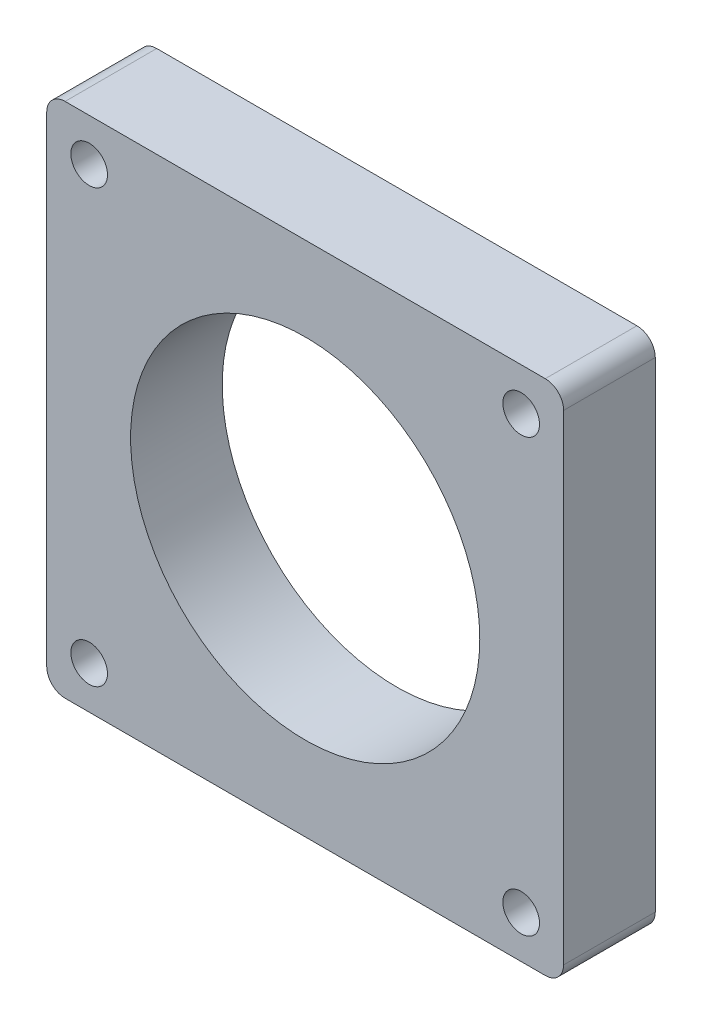
ISO-10303-21;
HEADER;
FILE_DESCRIPTION(('STEP AP214'),'2;1');
FILE_NAME('part.step','',(''),(''),'','','');
FILE_SCHEMA(('AUTOMOTIVE_DESIGN { 1 0 10303 214 1 1 1 1 }'));
ENDSEC;
DATA;
#1=APPLICATION_CONTEXT('core data for automotive mechanical design processes');
#2=APPLICATION_PROTOCOL_DEFINITION('international standard','automotive_design',2000,#1);
#3=PRODUCT_CONTEXT('',#1,'mechanical');
#4=PRODUCT('Part','Part','',(#3));
#5=PRODUCT_RELATED_PRODUCT_CATEGORY('part','',(#4));
#6=PRODUCT_DEFINITION_FORMATION('','',#4);
#7=PRODUCT_DEFINITION_CONTEXT('part definition',#1,'design');
#8=PRODUCT_DEFINITION('design','',#6,#7);
#9=PRODUCT_DEFINITION_SHAPE('','',#8);
#10=(LENGTH_UNIT() NAMED_UNIT(*) SI_UNIT(.MILLI.,.METRE.));
#11=(NAMED_UNIT(*) PLANE_ANGLE_UNIT() SI_UNIT($,.RADIAN.));
#12=(NAMED_UNIT(*) SI_UNIT($,.STERADIAN.) SOLID_ANGLE_UNIT());
#13=UNCERTAINTY_MEASURE_WITH_UNIT(LENGTH_MEASURE(1.E-05),#10,'distance_accuracy_value','');
#14=(GEOMETRIC_REPRESENTATION_CONTEXT(3) GLOBAL_UNCERTAINTY_ASSIGNED_CONTEXT((#13)) GLOBAL_UNIT_ASSIGNED_CONTEXT((#10,
#11,#12)) REPRESENTATION_CONTEXT('',''));
#15=CARTESIAN_POINT('',(0.,0.,0.));
#16=DIRECTION('',(0.,0.,1.));
#17=DIRECTION('',(1.,0.,0.));
#18=AXIS2_PLACEMENT_3D('',#15,#16,#17);
#19=CARTESIAN_POINT('',(0.,0.,10.));
#20=DIRECTION('',(0.,0.,-1.));
#21=DIRECTION('',(-1.,0.,0.));
#22=AXIS2_PLACEMENT_3D('',#19,#20,#21);
#23=PLANE('',#22);
#24=CARTESIAN_POINT('',(0.,0.,10.));
#25=DIRECTION('',(0.,0.,1.));
#26=DIRECTION('',(1.,0.,0.));
#27=AXIS2_PLACEMENT_3D('',#24,#25,#26);
#28=CIRCLE('',#27,19.05);
#29=CARTESIAN_POINT('',(19.05,0.,10.));
#30=VERTEX_POINT('',#29);
#31=EDGE_CURVE('E237',#30,#30,#28,.T.);
#32=ORIENTED_EDGE('',*,*,#31,.F.);
#33=EDGE_LOOP('',(#32));
#34=FACE_BOUND('',#33,.T.);
#35=DIRECTION('',(0.,-1.,0.));
#36=VECTOR('',#35,1.);
#37=CARTESIAN_POINT('',(-28.2,-28.2,10.));
#38=LINE('',#37,#36);
#39=CARTESIAN_POINT('',(-28.2,26.2,10.));
#40=VERTEX_POINT('',#39);
#41=CARTESIAN_POINT('',(-28.2,-26.2,10.));
#42=VERTEX_POINT('',#41);
#43=EDGE_CURVE('E196',#40,#42,#38,.T.);
#44=ORIENTED_EDGE('',*,*,#43,.T.);
#45=CARTESIAN_POINT('',(-26.2,-26.2,10.));
#46=DIRECTION('',(0.,0.,-1.));
#47=DIRECTION('',(-1.,0.,0.));
#48=AXIS2_PLACEMENT_3D('',#45,#46,#47);
#49=CIRCLE('',#48,2.);
#50=CARTESIAN_POINT('',(-26.2,-28.2,10.));
#51=VERTEX_POINT('',#50);
#52=EDGE_CURVE('E173',#42,#51,#49,.F.);
#53=ORIENTED_EDGE('',*,*,#52,.T.);
#54=DIRECTION('',(1.,0.,0.));
#55=VECTOR('',#54,1.);
#56=CARTESIAN_POINT('',(-28.2,-28.2,10.));
#57=LINE('',#56,#55);
#58=CARTESIAN_POINT('',(26.2,-28.2,10.));
#59=VERTEX_POINT('',#58);
#60=EDGE_CURVE('E132',#51,#59,#57,.T.);
#61=ORIENTED_EDGE('',*,*,#60,.T.);
#62=CARTESIAN_POINT('',(26.2,-26.2,10.));
#63=DIRECTION('',(0.,0.,-1.));
#64=DIRECTION('',(-1.,0.,0.));
#65=AXIS2_PLACEMENT_3D('',#62,#63,#64);
#66=CIRCLE('',#65,2.);
#67=CARTESIAN_POINT('',(28.2,-26.2,10.));
#68=VERTEX_POINT('',#67);
#69=EDGE_CURVE('E171',#59,#68,#66,.F.);
#70=ORIENTED_EDGE('',*,*,#69,.T.);
#71=DIRECTION('',(0.,1.,0.));
#72=VECTOR('',#71,1.);
#73=CARTESIAN_POINT('',(28.2,-28.2,10.));
#74=LINE('',#73,#72);
#75=CARTESIAN_POINT('',(28.2,26.2,10.));
#76=VERTEX_POINT('',#75);
#77=EDGE_CURVE('E143',#68,#76,#74,.T.);
#78=ORIENTED_EDGE('',*,*,#77,.T.);
#79=CARTESIAN_POINT('',(26.2,26.2,10.));
#80=DIRECTION('',(0.,0.,-1.));
#81=DIRECTION('',(-1.,0.,0.));
#82=AXIS2_PLACEMENT_3D('',#79,#80,#81);
#83=CIRCLE('',#82,2.);
#84=CARTESIAN_POINT('',(26.2,28.2,10.));
#85=VERTEX_POINT('',#84);
#86=EDGE_CURVE('E69',#76,#85,#83,.F.);
#87=ORIENTED_EDGE('',*,*,#86,.T.);
#88=DIRECTION('',(-1.,0.,0.));
#89=VECTOR('',#88,1.);
#90=CARTESIAN_POINT('',(-28.2,28.2,10.));
#91=LINE('',#90,#89);
#92=CARTESIAN_POINT('',(-26.2,28.2,10.));
#93=VERTEX_POINT('',#92);
#94=EDGE_CURVE('E148',#85,#93,#91,.T.);
#95=ORIENTED_EDGE('',*,*,#94,.T.);
#96=CARTESIAN_POINT('',(-26.2,26.2,10.));
#97=DIRECTION('',(0.,0.,-1.));
#98=DIRECTION('',(-1.,0.,0.));
#99=AXIS2_PLACEMENT_3D('',#96,#97,#98);
#100=CIRCLE('',#99,2.);
#101=EDGE_CURVE('E169',#93,#40,#100,.F.);
#102=ORIENTED_EDGE('',*,*,#101,.T.);
#103=EDGE_LOOP('',(#44,#53,#61,#70,#78,#87,#95,#102));
#104=FACE_BOUND('',#103,.T.);
#105=CARTESIAN_POINT('',(23.57,23.57,10.));
#106=DIRECTION('',(0.,0.,1.));
#107=DIRECTION('',(1.,0.,0.));
#108=AXIS2_PLACEMENT_3D('',#105,#106,#107);
#109=CIRCLE('',#108,2.00000000000001);
#110=CARTESIAN_POINT('',(25.57,23.57,10.));
#111=VERTEX_POINT('',#110);
#112=EDGE_CURVE('E195',#111,#111,#109,.T.);
#113=ORIENTED_EDGE('',*,*,#112,.F.);
#114=EDGE_LOOP('',(#113));
#115=FACE_BOUND('',#114,.T.);
#116=CARTESIAN_POINT('',(-23.57,23.57,10.));
#117=DIRECTION('',(0.,0.,1.));
#118=DIRECTION('',(-1.,0.,0.));
#119=AXIS2_PLACEMENT_3D('',#116,#117,#118);
#120=CIRCLE('',#119,2.);
#121=CARTESIAN_POINT('',(-25.57,23.57,10.));
#122=VERTEX_POINT('',#121);
#123=EDGE_CURVE('E208',#122,#122,#120,.T.);
#124=ORIENTED_EDGE('',*,*,#123,.F.);
#125=EDGE_LOOP('',(#124));
#126=FACE_BOUND('',#125,.T.);
#127=CARTESIAN_POINT('',(23.57,-23.57,10.));
#128=DIRECTION('',(0.,0.,1.));
#129=DIRECTION('',(-1.,0.,0.));
#130=AXIS2_PLACEMENT_3D('',#127,#128,#129);
#131=CIRCLE('',#130,2.00000000000001);
#132=CARTESIAN_POINT('',(21.57,-23.57,10.));
#133=VERTEX_POINT('',#132);
#134=EDGE_CURVE('E216',#133,#133,#131,.T.);
#135=ORIENTED_EDGE('',*,*,#134,.F.);
#136=EDGE_LOOP('',(#135));
#137=FACE_BOUND('',#136,.T.);
#138=CARTESIAN_POINT('',(-23.57,-23.57,10.));
#139=DIRECTION('',(0.,0.,1.));
#140=DIRECTION('',(1.,0.,0.));
#141=AXIS2_PLACEMENT_3D('',#138,#139,#140);
#142=CIRCLE('',#141,2.);
#143=CARTESIAN_POINT('',(-21.57,-23.57,10.));
#144=VERTEX_POINT('',#143);
#145=EDGE_CURVE('E221',#144,#144,#142,.T.);
#146=ORIENTED_EDGE('',*,*,#145,.F.);
#147=EDGE_LOOP('',(#146));
#148=FACE_BOUND('',#147,.T.);
#149=ADVANCED_FACE('F44',(#34,#104,#115,#126,#137,#148),#23,.F.);
#150=CARTESIAN_POINT('',(0.,0.,0.));
#151=DIRECTION('',(0.,0.,-1.));
#152=DIRECTION('',(-1.,0.,0.));
#153=AXIS2_PLACEMENT_3D('',#150,#151,#152);
#154=PLANE('',#153);
#155=CARTESIAN_POINT('',(0.,0.,0.));
#156=DIRECTION('',(0.,0.,1.));
#157=DIRECTION('',(1.,0.,0.));
#158=AXIS2_PLACEMENT_3D('',#155,#156,#157);
#159=CIRCLE('',#158,19.05);
#160=CARTESIAN_POINT('',(19.05,0.,0.));
#161=VERTEX_POINT('',#160);
#162=EDGE_CURVE('E231',#161,#161,#159,.T.);
#163=ORIENTED_EDGE('',*,*,#162,.T.);
#164=EDGE_LOOP('',(#163));
#165=FACE_BOUND('',#164,.T.);
#166=CARTESIAN_POINT('',(23.57,-23.57,0.));
#167=DIRECTION('',(0.,0.,1.));
#168=DIRECTION('',(-1.,0.,0.));
#169=AXIS2_PLACEMENT_3D('',#166,#167,#168);
#170=CIRCLE('',#169,2.00000000000001);
#171=CARTESIAN_POINT('',(21.57,-23.57,0.));
#172=VERTEX_POINT('',#171);
#173=EDGE_CURVE('E219',#172,#172,#170,.T.);
#174=ORIENTED_EDGE('',*,*,#173,.T.);
#175=EDGE_LOOP('',(#174));
#176=FACE_BOUND('',#175,.T.);
#177=CARTESIAN_POINT('',(23.57,23.57,0.));
#178=DIRECTION('',(0.,0.,1.));
#179=DIRECTION('',(1.,0.,0.));
#180=AXIS2_PLACEMENT_3D('',#177,#178,#179);
#181=CIRCLE('',#180,2.00000000000001);
#182=CARTESIAN_POINT('',(25.57,23.57,0.));
#183=VERTEX_POINT('',#182);
#184=EDGE_CURVE('E204',#183,#183,#181,.T.);
#185=ORIENTED_EDGE('',*,*,#184,.T.);
#186=EDGE_LOOP('',(#185));
#187=FACE_BOUND('',#186,.T.);
#188=DIRECTION('',(1.,0.,0.));
#189=VECTOR('',#188,1.);
#190=CARTESIAN_POINT('',(-28.2,-28.2,0.));
#191=LINE('',#190,#189);
#192=CARTESIAN_POINT('',(-26.2,-28.2,0.));
#193=VERTEX_POINT('',#192);
#194=CARTESIAN_POINT('',(26.2,-28.2,0.));
#195=VERTEX_POINT('',#194);
#196=EDGE_CURVE('E129',#193,#195,#191,.T.);
#197=ORIENTED_EDGE('',*,*,#196,.F.);
#198=CARTESIAN_POINT('',(-26.2,-26.2,0.));
#199=DIRECTION('',(0.,0.,-1.));
#200=DIRECTION('',(-1.,0.,0.));
#201=AXIS2_PLACEMENT_3D('',#198,#199,#200);
#202=CIRCLE('',#201,2.);
#203=CARTESIAN_POINT('',(-28.2,-26.2,0.));
#204=VERTEX_POINT('',#203);
#205=EDGE_CURVE('E112',#193,#204,#202,.T.);
#206=ORIENTED_EDGE('',*,*,#205,.T.);
#207=DIRECTION('',(0.,-1.,0.));
#208=VECTOR('',#207,1.);
#209=CARTESIAN_POINT('',(-28.2,-28.2,0.));
#210=LINE('',#209,#208);
#211=CARTESIAN_POINT('',(-28.2,26.2,0.));
#212=VERTEX_POINT('',#211);
#213=EDGE_CURVE('E142',#212,#204,#210,.T.);
#214=ORIENTED_EDGE('',*,*,#213,.F.);
#215=CARTESIAN_POINT('',(-26.2,26.2,0.));
#216=DIRECTION('',(0.,0.,-1.));
#217=DIRECTION('',(-1.,0.,0.));
#218=AXIS2_PLACEMENT_3D('',#215,#216,#217);
#219=CIRCLE('',#218,2.);
#220=CARTESIAN_POINT('',(-26.2,28.2,0.));
#221=VERTEX_POINT('',#220);
#222=EDGE_CURVE('E156',#212,#221,#219,.T.);
#223=ORIENTED_EDGE('',*,*,#222,.T.);
#224=DIRECTION('',(-1.,0.,0.));
#225=VECTOR('',#224,1.);
#226=CARTESIAN_POINT('',(-28.2,28.2,0.));
#227=LINE('',#226,#225);
#228=CARTESIAN_POINT('',(26.2,28.2,0.));
#229=VERTEX_POINT('',#228);
#230=EDGE_CURVE('E146',#229,#221,#227,.T.);
#231=ORIENTED_EDGE('',*,*,#230,.F.);
#232=CARTESIAN_POINT('',(26.2,26.2,0.));
#233=DIRECTION('',(0.,0.,-1.));
#234=DIRECTION('',(-1.,0.,0.));
#235=AXIS2_PLACEMENT_3D('',#232,#233,#234);
#236=CIRCLE('',#235,2.);
#237=CARTESIAN_POINT('',(28.2,26.2,0.));
#238=VERTEX_POINT('',#237);
#239=EDGE_CURVE('E133',#229,#238,#236,.T.);
#240=ORIENTED_EDGE('',*,*,#239,.T.);
#241=DIRECTION('',(0.,1.,0.));
#242=VECTOR('',#241,1.);
#243=CARTESIAN_POINT('',(28.2,-28.2,0.));
#244=LINE('',#243,#242);
#245=CARTESIAN_POINT('',(28.2,-26.2,0.));
#246=VERTEX_POINT('',#245);
#247=EDGE_CURVE('E194',#246,#238,#244,.T.);
#248=ORIENTED_EDGE('',*,*,#247,.F.);
#249=CARTESIAN_POINT('',(26.2,-26.2,0.));
#250=DIRECTION('',(0.,0.,-1.));
#251=DIRECTION('',(-1.,0.,0.));
#252=AXIS2_PLACEMENT_3D('',#249,#250,#251);
#253=CIRCLE('',#252,2.);
#254=EDGE_CURVE('E125',#246,#195,#253,.T.);
#255=ORIENTED_EDGE('',*,*,#254,.T.);
#256=EDGE_LOOP('',(#197,#206,#214,#223,#231,#240,#248,#255));
#257=FACE_BOUND('',#256,.T.);
#258=CARTESIAN_POINT('',(-23.57,23.57,0.));
#259=DIRECTION('',(0.,0.,1.));
#260=DIRECTION('',(-1.,0.,0.));
#261=AXIS2_PLACEMENT_3D('',#258,#259,#260);
#262=CIRCLE('',#261,2.);
#263=CARTESIAN_POINT('',(-25.57,23.57,0.));
#264=VERTEX_POINT('',#263);
#265=EDGE_CURVE('E215',#264,#264,#262,.T.);
#266=ORIENTED_EDGE('',*,*,#265,.T.);
#267=EDGE_LOOP('',(#266));
#268=FACE_BOUND('',#267,.T.);
#269=CARTESIAN_POINT('',(-23.57,-23.57,0.));
#270=DIRECTION('',(0.,0.,1.));
#271=DIRECTION('',(1.,0.,0.));
#272=AXIS2_PLACEMENT_3D('',#269,#270,#271);
#273=CIRCLE('',#272,2.);
#274=CARTESIAN_POINT('',(-21.57,-23.57,0.));
#275=VERTEX_POINT('',#274);
#276=EDGE_CURVE('E229',#275,#275,#273,.T.);
#277=ORIENTED_EDGE('',*,*,#276,.T.);
#278=EDGE_LOOP('',(#277));
#279=FACE_BOUND('',#278,.T.);
#280=ADVANCED_FACE('F136',(#165,#176,#187,#257,#268,#279),#154,.T.);
#281=CARTESIAN_POINT('',(28.2,-28.2,10.));
#282=DIRECTION('',(-1.,0.,0.));
#283=DIRECTION('',(0.,0.,1.));
#284=AXIS2_PLACEMENT_3D('',#281,#282,#283);
#285=PLANE('',#284);
#286=ORIENTED_EDGE('',*,*,#77,.F.);
#287=DIRECTION('',(0.,0.,-1.));
#288=VECTOR('',#287,1.);
#289=CARTESIAN_POINT('',(28.2,-26.2,10.));
#290=LINE('',#289,#288);
#291=EDGE_CURVE('E177',#68,#246,#290,.T.);
#292=ORIENTED_EDGE('',*,*,#291,.T.);
#293=ORIENTED_EDGE('',*,*,#247,.T.);
#294=DIRECTION('',(0.,0.,-1.));
#295=VECTOR('',#294,1.);
#296=CARTESIAN_POINT('',(28.2,26.2,10.));
#297=LINE('',#296,#295);
#298=EDGE_CURVE('E176',#238,#76,#297,.F.);
#299=ORIENTED_EDGE('',*,*,#298,.T.);
#300=EDGE_LOOP('',(#286,#292,#293,#299));
#301=FACE_BOUND('',#300,.T.);
#302=ADVANCED_FACE('F275',(#301),#285,.F.);
#303=CARTESIAN_POINT('',(-28.2,28.2,10.));
#304=DIRECTION('',(0.,-1.,0.));
#305=DIRECTION('',(1.,0.,0.));
#306=AXIS2_PLACEMENT_3D('',#303,#304,#305);
#307=PLANE('',#306);
#308=ORIENTED_EDGE('',*,*,#230,.T.);
#309=DIRECTION('',(0.,0.,-1.));
#310=VECTOR('',#309,1.);
#311=CARTESIAN_POINT('',(-26.2,28.2,10.));
#312=LINE('',#311,#310);
#313=EDGE_CURVE('E11',#221,#93,#312,.F.);
#314=ORIENTED_EDGE('',*,*,#313,.T.);
#315=ORIENTED_EDGE('',*,*,#94,.F.);
#316=DIRECTION('',(0.,0.,-1.));
#317=VECTOR('',#316,1.);
#318=CARTESIAN_POINT('',(26.2,28.2,10.));
#319=LINE('',#318,#317);
#320=EDGE_CURVE('E53',#85,#229,#319,.T.);
#321=ORIENTED_EDGE('',*,*,#320,.T.);
#322=EDGE_LOOP('',(#308,#314,#315,#321));
#323=FACE_BOUND('',#322,.T.);
#324=ADVANCED_FACE('F187',(#323),#307,.F.);
#325=CARTESIAN_POINT('',(-28.2,-28.2,10.));
#326=DIRECTION('',(1.,0.,0.));
#327=DIRECTION('',(0.,1.,0.));
#328=AXIS2_PLACEMENT_3D('',#325,#326,#327);
#329=PLANE('',#328);
#330=ORIENTED_EDGE('',*,*,#213,.T.);
#331=DIRECTION('',(0.,0.,-1.));
#332=VECTOR('',#331,1.);
#333=CARTESIAN_POINT('',(-28.2,-26.2,10.));
#334=LINE('',#333,#332);
#335=EDGE_CURVE('E116',#204,#42,#334,.F.);
#336=ORIENTED_EDGE('',*,*,#335,.T.);
#337=ORIENTED_EDGE('',*,*,#43,.F.);
#338=DIRECTION('',(0.,0.,-1.));
#339=VECTOR('',#338,1.);
#340=CARTESIAN_POINT('',(-28.2,26.2,10.));
#341=LINE('',#340,#339);
#342=EDGE_CURVE('E121',#40,#212,#341,.T.);
#343=ORIENTED_EDGE('',*,*,#342,.T.);
#344=EDGE_LOOP('',(#330,#336,#337,#343));
#345=FACE_BOUND('',#344,.T.);
#346=ADVANCED_FACE('F283',(#345),#329,.F.);
#347=CARTESIAN_POINT('',(-28.2,-28.2,10.));
#348=DIRECTION('',(0.,1.,0.));
#349=DIRECTION('',(0.,0.,1.));
#350=AXIS2_PLACEMENT_3D('',#347,#348,#349);
#351=PLANE('',#350);
#352=ORIENTED_EDGE('',*,*,#60,.F.);
#353=DIRECTION('',(0.,0.,-1.));
#354=VECTOR('',#353,1.);
#355=CARTESIAN_POINT('',(-26.2,-28.2,10.));
#356=LINE('',#355,#354);
#357=EDGE_CURVE('E113',#51,#193,#356,.T.);
#358=ORIENTED_EDGE('',*,*,#357,.T.);
#359=ORIENTED_EDGE('',*,*,#196,.T.);
#360=DIRECTION('',(0.,0.,-1.));
#361=VECTOR('',#360,1.);
#362=CARTESIAN_POINT('',(26.2,-28.2,10.));
#363=LINE('',#362,#361);
#364=EDGE_CURVE('E135',#195,#59,#363,.F.);
#365=ORIENTED_EDGE('',*,*,#364,.T.);
#366=EDGE_LOOP('',(#352,#358,#359,#365));
#367=FACE_BOUND('',#366,.T.);
#368=ADVANCED_FACE('F126',(#367),#351,.F.);
#369=CARTESIAN_POINT('',(23.57,23.57,10.));
#370=DIRECTION('',(0.,0.,-1.));
#371=DIRECTION('',(-1.,0.,0.));
#372=AXIS2_PLACEMENT_3D('',#369,#370,#371);
#373=CYLINDRICAL_SURFACE('',#372,2.00000000000001);
#374=ORIENTED_EDGE('',*,*,#112,.T.);
#375=EDGE_LOOP('',(#374));
#376=FACE_BOUND('',#375,.T.);
#377=ORIENTED_EDGE('',*,*,#184,.F.);
#378=EDGE_LOOP('',(#377));
#379=FACE_BOUND('',#378,.T.);
#380=ADVANCED_FACE('F284',(#376,#379),#373,.F.);
#381=CARTESIAN_POINT('',(-23.57,23.57,10.));
#382=DIRECTION('',(0.,0.,-1.));
#383=DIRECTION('',(-1.,0.,0.));
#384=AXIS2_PLACEMENT_3D('',#381,#382,#383);
#385=CYLINDRICAL_SURFACE('',#384,2.);
#386=ORIENTED_EDGE('',*,*,#123,.T.);
#387=EDGE_LOOP('',(#386));
#388=FACE_BOUND('',#387,.T.);
#389=ORIENTED_EDGE('',*,*,#265,.F.);
#390=EDGE_LOOP('',(#389));
#391=FACE_BOUND('',#390,.T.);
#392=ADVANCED_FACE('F350',(#388,#391),#385,.F.);
#393=CARTESIAN_POINT('',(23.57,-23.57,10.));
#394=DIRECTION('',(0.,0.,-1.));
#395=DIRECTION('',(-1.,0.,0.));
#396=AXIS2_PLACEMENT_3D('',#393,#394,#395);
#397=CYLINDRICAL_SURFACE('',#396,2.00000000000001);
#398=ORIENTED_EDGE('',*,*,#134,.T.);
#399=EDGE_LOOP('',(#398));
#400=FACE_BOUND('',#399,.T.);
#401=ORIENTED_EDGE('',*,*,#173,.F.);
#402=EDGE_LOOP('',(#401));
#403=FACE_BOUND('',#402,.T.);
#404=ADVANCED_FACE('F270',(#400,#403),#397,.F.);
#405=CARTESIAN_POINT('',(-23.57,-23.57,10.));
#406=DIRECTION('',(0.,0.,-1.));
#407=DIRECTION('',(-1.,0.,0.));
#408=AXIS2_PLACEMENT_3D('',#405,#406,#407);
#409=CYLINDRICAL_SURFACE('',#408,2.);
#410=ORIENTED_EDGE('',*,*,#145,.T.);
#411=EDGE_LOOP('',(#410));
#412=FACE_BOUND('',#411,.T.);
#413=ORIENTED_EDGE('',*,*,#276,.F.);
#414=EDGE_LOOP('',(#413));
#415=FACE_BOUND('',#414,.T.);
#416=ADVANCED_FACE('F248',(#412,#415),#409,.F.);
#417=CARTESIAN_POINT('',(0.,0.,0.));
#418=DIRECTION('',(0.,0.,1.));
#419=DIRECTION('',(1.,0.,0.));
#420=AXIS2_PLACEMENT_3D('',#417,#418,#419);
#421=CYLINDRICAL_SURFACE('',#420,19.05);
#422=ORIENTED_EDGE('',*,*,#162,.F.);
#423=EDGE_LOOP('',(#422));
#424=FACE_BOUND('',#423,.T.);
#425=ORIENTED_EDGE('',*,*,#31,.T.);
#426=EDGE_LOOP('',(#425));
#427=FACE_BOUND('',#426,.T.);
#428=ADVANCED_FACE('F249',(#424,#427),#421,.F.);
#429=CARTESIAN_POINT('',(-26.2,-26.2,10.));
#430=DIRECTION('',(0.,0.,-1.));
#431=DIRECTION('',(-1.,0.,0.));
#432=AXIS2_PLACEMENT_3D('',#429,#430,#431);
#433=CYLINDRICAL_SURFACE('',#432,2.);
#434=ORIENTED_EDGE('',*,*,#52,.F.);
#435=ORIENTED_EDGE('',*,*,#335,.F.);
#436=ORIENTED_EDGE('',*,*,#205,.F.);
#437=ORIENTED_EDGE('',*,*,#357,.F.);
#438=EDGE_LOOP('',(#434,#435,#436,#437));
#439=FACE_BOUND('',#438,.T.);
#440=ADVANCED_FACE('F111',(#439),#433,.T.);
#441=CARTESIAN_POINT('',(26.2,-26.2,10.));
#442=DIRECTION('',(0.,0.,-1.));
#443=DIRECTION('',(-1.,0.,0.));
#444=AXIS2_PLACEMENT_3D('',#441,#442,#443);
#445=CYLINDRICAL_SURFACE('',#444,2.);
#446=ORIENTED_EDGE('',*,*,#69,.F.);
#447=ORIENTED_EDGE('',*,*,#364,.F.);
#448=ORIENTED_EDGE('',*,*,#254,.F.);
#449=ORIENTED_EDGE('',*,*,#291,.F.);
#450=EDGE_LOOP('',(#446,#447,#448,#449));
#451=FACE_BOUND('',#450,.T.);
#452=ADVANCED_FACE('F295',(#451),#445,.T.);
#453=CARTESIAN_POINT('',(-26.2,26.2,10.));
#454=DIRECTION('',(0.,0.,-1.));
#455=DIRECTION('',(-1.,0.,0.));
#456=AXIS2_PLACEMENT_3D('',#453,#454,#455);
#457=CYLINDRICAL_SURFACE('',#456,2.);
#458=ORIENTED_EDGE('',*,*,#101,.F.);
#459=ORIENTED_EDGE('',*,*,#313,.F.);
#460=ORIENTED_EDGE('',*,*,#222,.F.);
#461=ORIENTED_EDGE('',*,*,#342,.F.);
#462=EDGE_LOOP('',(#458,#459,#460,#461));
#463=FACE_BOUND('',#462,.T.);
#464=ADVANCED_FACE('F294',(#463),#457,.T.);
#465=CARTESIAN_POINT('',(26.2,26.2,10.));
#466=DIRECTION('',(0.,0.,-1.));
#467=DIRECTION('',(-1.,0.,0.));
#468=AXIS2_PLACEMENT_3D('',#465,#466,#467);
#469=CYLINDRICAL_SURFACE('',#468,2.);
#470=ORIENTED_EDGE('',*,*,#86,.F.);
#471=ORIENTED_EDGE('',*,*,#298,.F.);
#472=ORIENTED_EDGE('',*,*,#239,.F.);
#473=ORIENTED_EDGE('',*,*,#320,.F.);
#474=EDGE_LOOP('',(#470,#471,#472,#473));
#475=FACE_BOUND('',#474,.T.);
#476=ADVANCED_FACE('F50',(#475),#469,.T.);
#477=CLOSED_SHELL('',(#149,#280,#302,#324,#346,#368,#380,#392,#404,#416,#428,#440,#452,#464,#476));
#478=MANIFOLD_SOLID_BREP('B2',#477);
#479=ADVANCED_BREP_SHAPE_REPRESENTATION('',(#18,#478),#14);
#480=SHAPE_DEFINITION_REPRESENTATION(#9,#479);
ENDSEC;
END-ISO-10303-21;
